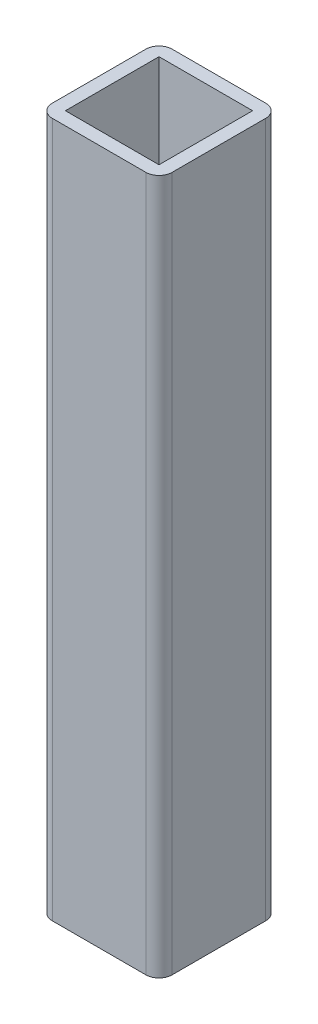
ISO-10303-21;
HEADER;
FILE_DESCRIPTION(('STEP AP214'),'2;1');
FILE_NAME('part.step','',(''),(''),'','','');
FILE_SCHEMA(('AUTOMOTIVE_DESIGN { 1 0 10303 214 1 1 1 1 }'));
ENDSEC;
DATA;
#1=APPLICATION_CONTEXT('core data for automotive mechanical design processes');
#2=APPLICATION_PROTOCOL_DEFINITION('international standard','automotive_design',2000,#1);
#3=PRODUCT_CONTEXT('',#1,'mechanical');
#4=PRODUCT('Part','Part','',(#3));
#5=PRODUCT_RELATED_PRODUCT_CATEGORY('part','',(#4));
#6=PRODUCT_DEFINITION_FORMATION('','',#4);
#7=PRODUCT_DEFINITION_CONTEXT('part definition',#1,'design');
#8=PRODUCT_DEFINITION('design','',#6,#7);
#9=PRODUCT_DEFINITION_SHAPE('','',#8);
#10=(LENGTH_UNIT() NAMED_UNIT(*) SI_UNIT(.MILLI.,.METRE.));
#11=(NAMED_UNIT(*) PLANE_ANGLE_UNIT() SI_UNIT($,.RADIAN.));
#12=(NAMED_UNIT(*) SI_UNIT($,.STERADIAN.) SOLID_ANGLE_UNIT());
#13=UNCERTAINTY_MEASURE_WITH_UNIT(LENGTH_MEASURE(1.E-05),#10,'distance_accuracy_value','');
#14=(GEOMETRIC_REPRESENTATION_CONTEXT(3) GLOBAL_UNCERTAINTY_ASSIGNED_CONTEXT((#13)) GLOBAL_UNIT_ASSIGNED_CONTEXT((#10,
#11,#12)) REPRESENTATION_CONTEXT('',''));
#15=CARTESIAN_POINT('',(0.,0.,0.));
#16=DIRECTION('',(0.,0.,1.));
#17=DIRECTION('',(1.,0.,0.));
#18=AXIS2_PLACEMENT_3D('',#15,#16,#17);
#19=CARTESIAN_POINT('',(22.8,148.5,2.8));
#20=DIRECTION('',(0.,-1.,0.));
#21=DIRECTION('',(0.,0.,-1.));
#22=AXIS2_PLACEMENT_3D('',#19,#20,#21);
#23=CYLINDRICAL_SURFACE('',#22,2.8);
#24=CARTESIAN_POINT('',(22.8,0.,2.8));
#25=DIRECTION('',(0.,1.,0.));
#26=DIRECTION('',(0.,0.,-1.));
#27=AXIS2_PLACEMENT_3D('',#24,#25,#26);
#28=CIRCLE('',#27,2.8);
#29=CARTESIAN_POINT('',(25.6,0.,2.80000000000002));
#30=VERTEX_POINT('',#29);
#31=CARTESIAN_POINT('',(22.8,0.,0.));
#32=VERTEX_POINT('',#31);
#33=EDGE_CURVE('E155',#30,#32,#28,.T.);
#34=ORIENTED_EDGE('',*,*,#33,.T.);
#35=DIRECTION('',(0.,-1.,0.));
#36=VECTOR('',#35,1.);
#37=CARTESIAN_POINT('',(22.8,148.5,0.));
#38=LINE('',#37,#36);
#39=CARTESIAN_POINT('',(22.8,148.5,0.));
#40=VERTEX_POINT('',#39);
#41=EDGE_CURVE('E11',#40,#32,#38,.T.);
#42=ORIENTED_EDGE('',*,*,#41,.F.);
#43=CARTESIAN_POINT('',(22.8,148.5,2.8));
#44=DIRECTION('',(0.,1.,0.));
#45=DIRECTION('',(0.,0.,-1.));
#46=AXIS2_PLACEMENT_3D('',#43,#44,#45);
#47=CIRCLE('',#46,2.8);
#48=CARTESIAN_POINT('',(25.6,148.5,2.80000000000002));
#49=VERTEX_POINT('',#48);
#50=EDGE_CURVE('E159',#49,#40,#47,.T.);
#51=ORIENTED_EDGE('',*,*,#50,.F.);
#52=DIRECTION('',(0.,-1.,0.));
#53=VECTOR('',#52,1.);
#54=CARTESIAN_POINT('',(25.6,148.5,2.80000000000002));
#55=LINE('',#54,#53);
#56=EDGE_CURVE('E177',#49,#30,#55,.T.);
#57=ORIENTED_EDGE('',*,*,#56,.T.);
#58=EDGE_LOOP('',(#34,#42,#51,#57));
#59=FACE_BOUND('',#58,.T.);
#60=ADVANCED_FACE('F34',(#59),#23,.T.);
#61=CARTESIAN_POINT('',(2.80000000000002,148.5,0.));
#62=DIRECTION('',(0.,0.,1.));
#63=DIRECTION('',(1.,0.,0.));
#64=AXIS2_PLACEMENT_3D('',#61,#62,#63);
#65=PLANE('',#64);
#66=DIRECTION('',(-1.,0.,0.));
#67=VECTOR('',#66,1.);
#68=CARTESIAN_POINT('',(2.80000000000002,0.,0.));
#69=LINE('',#68,#67);
#70=CARTESIAN_POINT('',(2.80000000000002,0.,0.));
#71=VERTEX_POINT('',#70);
#72=EDGE_CURVE('E180',#32,#71,#69,.T.);
#73=ORIENTED_EDGE('',*,*,#72,.T.);
#74=DIRECTION('',(0.,-1.,0.));
#75=VECTOR('',#74,1.);
#76=CARTESIAN_POINT('',(2.80000000000002,148.5,0.));
#77=LINE('',#76,#75);
#78=CARTESIAN_POINT('',(2.80000000000002,148.5,0.));
#79=VERTEX_POINT('',#78);
#80=EDGE_CURVE('E41',#79,#71,#77,.T.);
#81=ORIENTED_EDGE('',*,*,#80,.F.);
#82=DIRECTION('',(-1.,0.,0.));
#83=VECTOR('',#82,1.);
#84=CARTESIAN_POINT('',(2.80000000000002,148.5,0.));
#85=LINE('',#84,#83);
#86=EDGE_CURVE('E162',#40,#79,#85,.T.);
#87=ORIENTED_EDGE('',*,*,#86,.F.);
#88=ORIENTED_EDGE('',*,*,#41,.T.);
#89=EDGE_LOOP('',(#73,#81,#87,#88));
#90=FACE_BOUND('',#89,.T.);
#91=ADVANCED_FACE('F235',(#90),#65,.F.);
#92=CARTESIAN_POINT('',(2.8,148.5,2.8));
#93=DIRECTION('',(0.,-1.,0.));
#94=DIRECTION('',(0.,0.,-1.));
#95=AXIS2_PLACEMENT_3D('',#92,#93,#94);
#96=CYLINDRICAL_SURFACE('',#95,2.8);
#97=CARTESIAN_POINT('',(2.8,0.,2.8));
#98=DIRECTION('',(0.,1.,0.));
#99=DIRECTION('',(0.,0.,1.));
#100=AXIS2_PLACEMENT_3D('',#97,#98,#99);
#101=CIRCLE('',#100,2.8);
#102=CARTESIAN_POINT('',(0.,0.,2.80000000000002));
#103=VERTEX_POINT('',#102);
#104=EDGE_CURVE('E182',#71,#103,#101,.T.);
#105=ORIENTED_EDGE('',*,*,#104,.T.);
#106=DIRECTION('',(0.,-1.,0.));
#107=VECTOR('',#106,1.);
#108=CARTESIAN_POINT('',(0.,148.5,2.80000000000002));
#109=LINE('',#108,#107);
#110=CARTESIAN_POINT('',(0.,148.5,2.80000000000002));
#111=VERTEX_POINT('',#110);
#112=EDGE_CURVE('E207',#111,#103,#109,.T.);
#113=ORIENTED_EDGE('',*,*,#112,.F.);
#114=CARTESIAN_POINT('',(2.8,148.5,2.8));
#115=DIRECTION('',(0.,1.,0.));
#116=DIRECTION('',(0.,0.,1.));
#117=AXIS2_PLACEMENT_3D('',#114,#115,#116);
#118=CIRCLE('',#117,2.8);
#119=EDGE_CURVE('E165',#79,#111,#118,.T.);
#120=ORIENTED_EDGE('',*,*,#119,.F.);
#121=ORIENTED_EDGE('',*,*,#80,.T.);
#122=EDGE_LOOP('',(#105,#113,#120,#121));
#123=FACE_BOUND('',#122,.T.);
#124=ADVANCED_FACE('F214',(#123),#96,.T.);
#125=CARTESIAN_POINT('',(0.,148.5,2.80000000000002));
#126=DIRECTION('',(1.,0.,0.));
#127=DIRECTION('',(0.,0.,-1.));
#128=AXIS2_PLACEMENT_3D('',#125,#126,#127);
#129=PLANE('',#128);
#130=DIRECTION('',(0.,0.,1.));
#131=VECTOR('',#130,1.);
#132=CARTESIAN_POINT('',(0.,0.,2.80000000000002));
#133=LINE('',#132,#131);
#134=CARTESIAN_POINT('',(0.,0.,22.8));
#135=VERTEX_POINT('',#134);
#136=EDGE_CURVE('E184',#103,#135,#133,.T.);
#137=ORIENTED_EDGE('',*,*,#136,.T.);
#138=DIRECTION('',(0.,-1.,0.));
#139=VECTOR('',#138,1.);
#140=CARTESIAN_POINT('',(0.,148.5,22.8));
#141=LINE('',#140,#139);
#142=CARTESIAN_POINT('',(0.,148.5,22.8));
#143=VERTEX_POINT('',#142);
#144=EDGE_CURVE('E204',#143,#135,#141,.T.);
#145=ORIENTED_EDGE('',*,*,#144,.F.);
#146=DIRECTION('',(0.,0.,1.));
#147=VECTOR('',#146,1.);
#148=CARTESIAN_POINT('',(0.,148.5,2.80000000000002));
#149=LINE('',#148,#147);
#150=EDGE_CURVE('E167',#111,#143,#149,.T.);
#151=ORIENTED_EDGE('',*,*,#150,.F.);
#152=ORIENTED_EDGE('',*,*,#112,.T.);
#153=EDGE_LOOP('',(#137,#145,#151,#152));
#154=FACE_BOUND('',#153,.T.);
#155=ADVANCED_FACE('F225',(#154),#129,.F.);
#156=CARTESIAN_POINT('',(2.8,148.5,22.8));
#157=DIRECTION('',(0.,-1.,0.));
#158=DIRECTION('',(0.,0.,-1.));
#159=AXIS2_PLACEMENT_3D('',#156,#157,#158);
#160=CYLINDRICAL_SURFACE('',#159,2.8);
#161=CARTESIAN_POINT('',(2.8,0.,22.8));
#162=DIRECTION('',(0.,1.,0.));
#163=DIRECTION('',(0.,0.,1.));
#164=AXIS2_PLACEMENT_3D('',#161,#162,#163);
#165=CIRCLE('',#164,2.8);
#166=CARTESIAN_POINT('',(2.80000000000002,0.,25.6));
#167=VERTEX_POINT('',#166);
#168=EDGE_CURVE('E186',#135,#167,#165,.T.);
#169=ORIENTED_EDGE('',*,*,#168,.T.);
#170=DIRECTION('',(0.,-1.,0.));
#171=VECTOR('',#170,1.);
#172=CARTESIAN_POINT('',(2.80000000000002,148.5,25.6));
#173=LINE('',#172,#171);
#174=CARTESIAN_POINT('',(2.80000000000002,148.5,25.6));
#175=VERTEX_POINT('',#174);
#176=EDGE_CURVE('E201',#175,#167,#173,.T.);
#177=ORIENTED_EDGE('',*,*,#176,.F.);
#178=CARTESIAN_POINT('',(2.8,148.5,22.8));
#179=DIRECTION('',(0.,1.,0.));
#180=DIRECTION('',(0.,0.,1.));
#181=AXIS2_PLACEMENT_3D('',#178,#179,#180);
#182=CIRCLE('',#181,2.8);
#183=EDGE_CURVE('E169',#143,#175,#182,.T.);
#184=ORIENTED_EDGE('',*,*,#183,.F.);
#185=ORIENTED_EDGE('',*,*,#144,.T.);
#186=EDGE_LOOP('',(#169,#177,#184,#185));
#187=FACE_BOUND('',#186,.T.);
#188=ADVANCED_FACE('F229',(#187),#160,.T.);
#189=CARTESIAN_POINT('',(2.80000000000002,148.5,25.6));
#190=DIRECTION('',(0.,0.,-1.));
#191=DIRECTION('',(-1.,0.,0.));
#192=AXIS2_PLACEMENT_3D('',#189,#190,#191);
#193=PLANE('',#192);
#194=DIRECTION('',(1.,0.,0.));
#195=VECTOR('',#194,1.);
#196=CARTESIAN_POINT('',(2.80000000000002,0.,25.6));
#197=LINE('',#196,#195);
#198=CARTESIAN_POINT('',(22.8,0.,25.6));
#199=VERTEX_POINT('',#198);
#200=EDGE_CURVE('E188',#167,#199,#197,.T.);
#201=ORIENTED_EDGE('',*,*,#200,.T.);
#202=DIRECTION('',(0.,-1.,0.));
#203=VECTOR('',#202,1.);
#204=CARTESIAN_POINT('',(22.8,148.5,25.6));
#205=LINE('',#204,#203);
#206=CARTESIAN_POINT('',(22.8,148.5,25.6));
#207=VERTEX_POINT('',#206);
#208=EDGE_CURVE('E198',#207,#199,#205,.T.);
#209=ORIENTED_EDGE('',*,*,#208,.F.);
#210=DIRECTION('',(1.,0.,0.));
#211=VECTOR('',#210,1.);
#212=CARTESIAN_POINT('',(2.80000000000002,148.5,25.6));
#213=LINE('',#212,#211);
#214=EDGE_CURVE('E171',#175,#207,#213,.T.);
#215=ORIENTED_EDGE('',*,*,#214,.F.);
#216=ORIENTED_EDGE('',*,*,#176,.T.);
#217=EDGE_LOOP('',(#201,#209,#215,#216));
#218=FACE_BOUND('',#217,.T.);
#219=ADVANCED_FACE('F248',(#218),#193,.F.);
#220=CARTESIAN_POINT('',(22.8,148.5,22.8));
#221=DIRECTION('',(0.,-1.,0.));
#222=DIRECTION('',(0.,0.,-1.));
#223=AXIS2_PLACEMENT_3D('',#220,#221,#222);
#224=CYLINDRICAL_SURFACE('',#223,2.8);
#225=CARTESIAN_POINT('',(22.8,0.,22.8));
#226=DIRECTION('',(0.,1.,0.));
#227=DIRECTION('',(0.,0.,1.));
#228=AXIS2_PLACEMENT_3D('',#225,#226,#227);
#229=CIRCLE('',#228,2.8);
#230=CARTESIAN_POINT('',(25.6,0.,22.8));
#231=VERTEX_POINT('',#230);
#232=EDGE_CURVE('E190',#199,#231,#229,.T.);
#233=ORIENTED_EDGE('',*,*,#232,.T.);
#234=DIRECTION('',(0.,-1.,0.));
#235=VECTOR('',#234,1.);
#236=CARTESIAN_POINT('',(25.6,148.5,22.8));
#237=LINE('',#236,#235);
#238=CARTESIAN_POINT('',(25.6,148.5,22.8));
#239=VERTEX_POINT('',#238);
#240=EDGE_CURVE('E195',#239,#231,#237,.T.);
#241=ORIENTED_EDGE('',*,*,#240,.F.);
#242=CARTESIAN_POINT('',(22.8,148.5,22.8));
#243=DIRECTION('',(0.,1.,0.));
#244=DIRECTION('',(0.,0.,1.));
#245=AXIS2_PLACEMENT_3D('',#242,#243,#244);
#246=CIRCLE('',#245,2.8);
#247=EDGE_CURVE('E173',#207,#239,#246,.T.);
#248=ORIENTED_EDGE('',*,*,#247,.F.);
#249=ORIENTED_EDGE('',*,*,#208,.T.);
#250=EDGE_LOOP('',(#233,#241,#248,#249));
#251=FACE_BOUND('',#250,.T.);
#252=ADVANCED_FACE('F246',(#251),#224,.T.);
#253=CARTESIAN_POINT('',(25.6,148.5,2.80000000000002));
#254=DIRECTION('',(-1.,0.,0.));
#255=DIRECTION('',(0.,0.,1.));
#256=AXIS2_PLACEMENT_3D('',#253,#254,#255);
#257=PLANE('',#256);
#258=DIRECTION('',(0.,0.,-1.));
#259=VECTOR('',#258,1.);
#260=CARTESIAN_POINT('',(25.6,0.,2.80000000000002));
#261=LINE('',#260,#259);
#262=EDGE_CURVE('E163',#231,#30,#261,.T.);
#263=ORIENTED_EDGE('',*,*,#262,.T.);
#264=ORIENTED_EDGE('',*,*,#56,.F.);
#265=DIRECTION('',(0.,0.,-1.));
#266=VECTOR('',#265,1.);
#267=CARTESIAN_POINT('',(25.6,148.5,2.80000000000002));
#268=LINE('',#267,#266);
#269=EDGE_CURVE('E175',#239,#49,#268,.T.);
#270=ORIENTED_EDGE('',*,*,#269,.F.);
#271=ORIENTED_EDGE('',*,*,#240,.T.);
#272=EDGE_LOOP('',(#263,#264,#270,#271));
#273=FACE_BOUND('',#272,.T.);
#274=ADVANCED_FACE('F241',(#273),#257,.F.);
#275=CARTESIAN_POINT('',(22.8,148.5,2.8));
#276=DIRECTION('',(0.,-1.,0.));
#277=DIRECTION('',(0.,0.,-1.));
#278=AXIS2_PLACEMENT_3D('',#275,#276,#277);
#279=PLANE('',#278);
#280=DIRECTION('',(1.,0.,0.));
#281=VECTOR('',#280,1.);
#282=CARTESIAN_POINT('',(2.8,148.5,2.8));
#283=LINE('',#282,#281);
#284=CARTESIAN_POINT('',(2.8,148.5,2.8));
#285=VERTEX_POINT('',#284);
#286=CARTESIAN_POINT('',(22.8,148.5,2.8));
#287=VERTEX_POINT('',#286);
#288=EDGE_CURVE('E130',#285,#287,#283,.T.);
#289=ORIENTED_EDGE('',*,*,#288,.T.);
#290=DIRECTION('',(0.,0.,1.));
#291=VECTOR('',#290,1.);
#292=CARTESIAN_POINT('',(22.8,148.5,2.8));
#293=LINE('',#292,#291);
#294=CARTESIAN_POINT('',(22.8,148.5,22.8));
#295=VERTEX_POINT('',#294);
#296=EDGE_CURVE('E124',#287,#295,#293,.T.);
#297=ORIENTED_EDGE('',*,*,#296,.T.);
#298=DIRECTION('',(-1.,0.,0.));
#299=VECTOR('',#298,1.);
#300=CARTESIAN_POINT('',(2.8,148.5,22.8));
#301=LINE('',#300,#299);
#302=CARTESIAN_POINT('',(2.8,148.5,22.8));
#303=VERTEX_POINT('',#302);
#304=EDGE_CURVE('E133',#295,#303,#301,.T.);
#305=ORIENTED_EDGE('',*,*,#304,.T.);
#306=DIRECTION('',(0.,0.,-1.));
#307=VECTOR('',#306,1.);
#308=CARTESIAN_POINT('',(2.8,148.5,2.8));
#309=LINE('',#308,#307);
#310=EDGE_CURVE('E48',#303,#285,#309,.T.);
#311=ORIENTED_EDGE('',*,*,#310,.T.);
#312=EDGE_LOOP('',(#289,#297,#305,#311));
#313=FACE_BOUND('',#312,.T.);
#314=ORIENTED_EDGE('',*,*,#50,.T.);
#315=ORIENTED_EDGE('',*,*,#86,.T.);
#316=ORIENTED_EDGE('',*,*,#119,.T.);
#317=ORIENTED_EDGE('',*,*,#150,.T.);
#318=ORIENTED_EDGE('',*,*,#183,.T.);
#319=ORIENTED_EDGE('',*,*,#214,.T.);
#320=ORIENTED_EDGE('',*,*,#247,.T.);
#321=ORIENTED_EDGE('',*,*,#269,.T.);
#322=EDGE_LOOP('',(#314,#315,#316,#317,#318,#319,#320,#321));
#323=FACE_BOUND('',#322,.T.);
#324=ADVANCED_FACE('F137',(#313,#323),#279,.F.);
#325=CARTESIAN_POINT('',(22.8,0.,2.8));
#326=DIRECTION('',(0.,-1.,0.));
#327=DIRECTION('',(0.,0.,-1.));
#328=AXIS2_PLACEMENT_3D('',#325,#326,#327);
#329=PLANE('',#328);
#330=DIRECTION('',(0.,0.,1.));
#331=VECTOR('',#330,1.);
#332=CARTESIAN_POINT('',(22.8,0.,2.8));
#333=LINE('',#332,#331);
#334=CARTESIAN_POINT('',(22.8,0.,2.8));
#335=VERTEX_POINT('',#334);
#336=CARTESIAN_POINT('',(22.8,0.,22.8));
#337=VERTEX_POINT('',#336);
#338=EDGE_CURVE('E56',#335,#337,#333,.T.);
#339=ORIENTED_EDGE('',*,*,#338,.F.);
#340=DIRECTION('',(1.,0.,0.));
#341=VECTOR('',#340,1.);
#342=CARTESIAN_POINT('',(2.8,0.,2.8));
#343=LINE('',#342,#341);
#344=CARTESIAN_POINT('',(2.8,0.,2.8));
#345=VERTEX_POINT('',#344);
#346=EDGE_CURVE('E140',#345,#335,#343,.T.);
#347=ORIENTED_EDGE('',*,*,#346,.F.);
#348=DIRECTION('',(0.,0.,-1.));
#349=VECTOR('',#348,1.);
#350=CARTESIAN_POINT('',(2.8,0.,2.8));
#351=LINE('',#350,#349);
#352=CARTESIAN_POINT('',(2.8,0.,22.8));
#353=VERTEX_POINT('',#352);
#354=EDGE_CURVE('E143',#353,#345,#351,.T.);
#355=ORIENTED_EDGE('',*,*,#354,.F.);
#356=DIRECTION('',(-1.,0.,0.));
#357=VECTOR('',#356,1.);
#358=CARTESIAN_POINT('',(2.8,0.,22.8));
#359=LINE('',#358,#357);
#360=EDGE_CURVE('E149',#337,#353,#359,.T.);
#361=ORIENTED_EDGE('',*,*,#360,.F.);
#362=EDGE_LOOP('',(#339,#347,#355,#361));
#363=FACE_BOUND('',#362,.T.);
#364=ORIENTED_EDGE('',*,*,#33,.F.);
#365=ORIENTED_EDGE('',*,*,#262,.F.);
#366=ORIENTED_EDGE('',*,*,#232,.F.);
#367=ORIENTED_EDGE('',*,*,#200,.F.);
#368=ORIENTED_EDGE('',*,*,#168,.F.);
#369=ORIENTED_EDGE('',*,*,#136,.F.);
#370=ORIENTED_EDGE('',*,*,#104,.F.);
#371=ORIENTED_EDGE('',*,*,#72,.F.);
#372=EDGE_LOOP('',(#364,#365,#366,#367,#368,#369,#370,#371));
#373=FACE_BOUND('',#372,.T.);
#374=ADVANCED_FACE('F220',(#363,#373),#329,.T.);
#375=CARTESIAN_POINT('',(22.8,148.5,2.8));
#376=DIRECTION('',(1.,0.,0.));
#377=DIRECTION('',(0.,0.,-1.));
#378=AXIS2_PLACEMENT_3D('',#375,#376,#377);
#379=PLANE('',#378);
#380=ORIENTED_EDGE('',*,*,#338,.T.);
#381=DIRECTION('',(0.,-1.,0.));
#382=VECTOR('',#381,1.);
#383=CARTESIAN_POINT('',(22.8,148.5,22.8));
#384=LINE('',#383,#382);
#385=EDGE_CURVE('E120',#295,#337,#384,.T.);
#386=ORIENTED_EDGE('',*,*,#385,.F.);
#387=ORIENTED_EDGE('',*,*,#296,.F.);
#388=DIRECTION('',(0.,-1.,0.));
#389=VECTOR('',#388,1.);
#390=CARTESIAN_POINT('',(22.8,148.5,2.8));
#391=LINE('',#390,#389);
#392=EDGE_CURVE('E153',#287,#335,#391,.T.);
#393=ORIENTED_EDGE('',*,*,#392,.T.);
#394=EDGE_LOOP('',(#380,#386,#387,#393));
#395=FACE_BOUND('',#394,.T.);
#396=ADVANCED_FACE('F122',(#395),#379,.F.);
#397=CARTESIAN_POINT('',(2.8,148.5,2.8));
#398=DIRECTION('',(0.,0.,-1.));
#399=DIRECTION('',(-1.,0.,0.));
#400=AXIS2_PLACEMENT_3D('',#397,#398,#399);
#401=PLANE('',#400);
#402=ORIENTED_EDGE('',*,*,#346,.T.);
#403=ORIENTED_EDGE('',*,*,#392,.F.);
#404=ORIENTED_EDGE('',*,*,#288,.F.);
#405=DIRECTION('',(0.,-1.,0.));
#406=VECTOR('',#405,1.);
#407=CARTESIAN_POINT('',(2.8,148.5,2.8));
#408=LINE('',#407,#406);
#409=EDGE_CURVE('E156',#285,#345,#408,.T.);
#410=ORIENTED_EDGE('',*,*,#409,.T.);
#411=EDGE_LOOP('',(#402,#403,#404,#410));
#412=FACE_BOUND('',#411,.T.);
#413=ADVANCED_FACE('F319',(#412),#401,.F.);
#414=CARTESIAN_POINT('',(2.8,148.5,2.8));
#415=DIRECTION('',(-1.,0.,0.));
#416=DIRECTION('',(0.,0.,1.));
#417=AXIS2_PLACEMENT_3D('',#414,#415,#416);
#418=PLANE('',#417);
#419=ORIENTED_EDGE('',*,*,#354,.T.);
#420=ORIENTED_EDGE('',*,*,#409,.F.);
#421=ORIENTED_EDGE('',*,*,#310,.F.);
#422=DIRECTION('',(0.,-1.,0.));
#423=VECTOR('',#422,1.);
#424=CARTESIAN_POINT('',(2.8,148.5,22.8));
#425=LINE('',#424,#423);
#426=EDGE_CURVE('E129',#303,#353,#425,.T.);
#427=ORIENTED_EDGE('',*,*,#426,.T.);
#428=EDGE_LOOP('',(#419,#420,#421,#427));
#429=FACE_BOUND('',#428,.T.);
#430=ADVANCED_FACE('F328',(#429),#418,.F.);
#431=CARTESIAN_POINT('',(2.8,148.5,22.8));
#432=DIRECTION('',(0.,0.,1.));
#433=DIRECTION('',(1.,0.,0.));
#434=AXIS2_PLACEMENT_3D('',#431,#432,#433);
#435=PLANE('',#434);
#436=ORIENTED_EDGE('',*,*,#360,.T.);
#437=ORIENTED_EDGE('',*,*,#426,.F.);
#438=ORIENTED_EDGE('',*,*,#304,.F.);
#439=ORIENTED_EDGE('',*,*,#385,.T.);
#440=EDGE_LOOP('',(#436,#437,#438,#439));
#441=FACE_BOUND('',#440,.T.);
#442=ADVANCED_FACE('F134',(#441),#435,.F.);
#443=CLOSED_SHELL('',(#60,#91,#124,#155,#188,#219,#252,#274,#324,#374,#396,#413,#430,#442));
#444=MANIFOLD_SOLID_BREP('B2',#443);
#445=ADVANCED_BREP_SHAPE_REPRESENTATION('',(#18,#444),#14);
#446=SHAPE_DEFINITION_REPRESENTATION(#9,#445);
ENDSEC;
END-ISO-10303-21;
